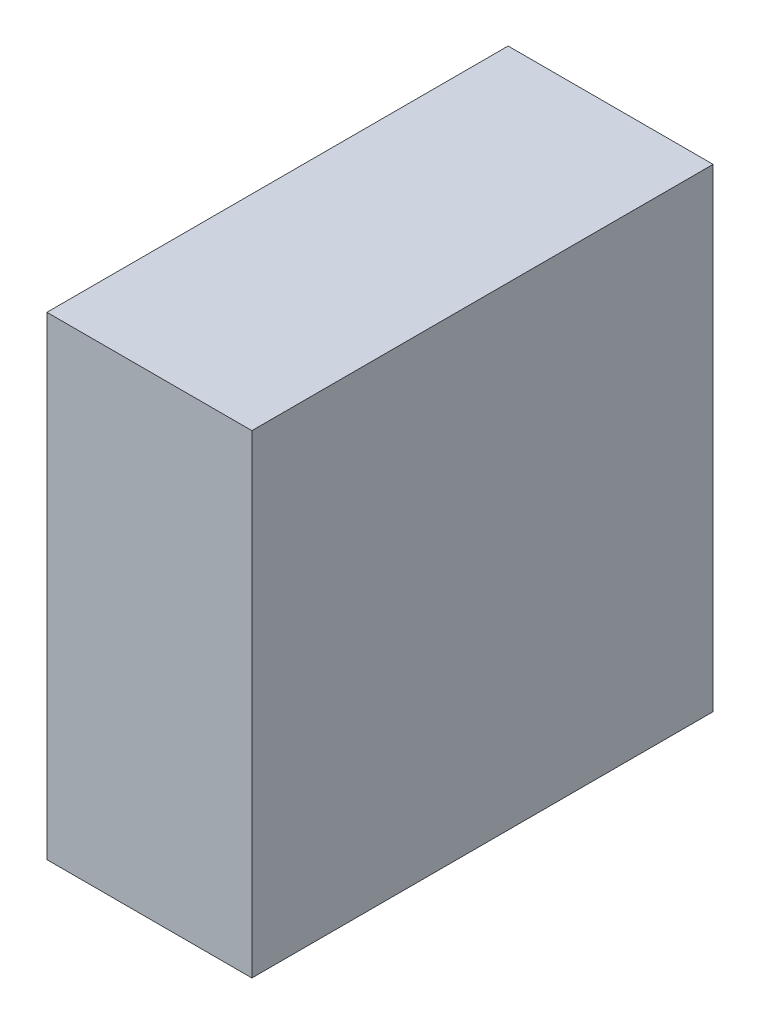
ISO-10303-21;
HEADER;
FILE_DESCRIPTION(('STEP AP214'),'2;1');
FILE_NAME('part.step','',(''),(''),'','','');
FILE_SCHEMA(('AUTOMOTIVE_DESIGN { 1 0 10303 214 1 1 1 1 }'));
ENDSEC;
DATA;
#1=APPLICATION_CONTEXT('core data for automotive mechanical design processes');
#2=APPLICATION_PROTOCOL_DEFINITION('international standard','automotive_design',2000,#1);
#3=PRODUCT_CONTEXT('',#1,'mechanical');
#4=PRODUCT('Part','Part','',(#3));
#5=PRODUCT_RELATED_PRODUCT_CATEGORY('part','',(#4));
#6=PRODUCT_DEFINITION_FORMATION('','',#4);
#7=PRODUCT_DEFINITION_CONTEXT('part definition',#1,'design');
#8=PRODUCT_DEFINITION('design','',#6,#7);
#9=PRODUCT_DEFINITION_SHAPE('','',#8);
#10=(LENGTH_UNIT() NAMED_UNIT(*) SI_UNIT(.MILLI.,.METRE.));
#11=(NAMED_UNIT(*) PLANE_ANGLE_UNIT() SI_UNIT($,.RADIAN.));
#12=(NAMED_UNIT(*) SI_UNIT($,.STERADIAN.) SOLID_ANGLE_UNIT());
#13=UNCERTAINTY_MEASURE_WITH_UNIT(LENGTH_MEASURE(1.E-05),#10,'distance_accuracy_value','');
#14=(GEOMETRIC_REPRESENTATION_CONTEXT(3) GLOBAL_UNCERTAINTY_ASSIGNED_CONTEXT((#13)) GLOBAL_UNIT_ASSIGNED_CONTEXT((#10,
#11,#12)) REPRESENTATION_CONTEXT('',''));
#15=CARTESIAN_POINT('',(0.,0.,0.));
#16=DIRECTION('',(0.,0.,1.));
#17=DIRECTION('',(1.,0.,0.));
#18=AXIS2_PLACEMENT_3D('',#15,#16,#17);
#19=CARTESIAN_POINT('',(4.,-9.24999999999999,-9.));
#20=DIRECTION('',(0.,1.,0.));
#21=DIRECTION('',(0.,0.,1.));
#22=AXIS2_PLACEMENT_3D('',#19,#20,#21);
#23=PLANE('',#22);
#24=DIRECTION('',(0.,0.,-1.));
#25=VECTOR('',#24,1.);
#26=CARTESIAN_POINT('',(-4.,-9.24999999999999,-9.));
#27=LINE('',#26,#25);
#28=CARTESIAN_POINT('',(-4.,-9.24999999999999,9.));
#29=VERTEX_POINT('',#28);
#30=CARTESIAN_POINT('',(-4.,-9.24999999999999,-9.));
#31=VERTEX_POINT('',#30);
#32=EDGE_CURVE('E102',#29,#31,#27,.T.);
#33=ORIENTED_EDGE('',*,*,#32,.T.);
#34=DIRECTION('',(-1.,0.,0.));
#35=VECTOR('',#34,1.);
#36=CARTESIAN_POINT('',(4.,-9.24999999999999,-9.));
#37=LINE('',#36,#35);
#38=CARTESIAN_POINT('',(4.,-9.24999999999999,-9.));
#39=VERTEX_POINT('',#38);
#40=EDGE_CURVE('E11',#39,#31,#37,.T.);
#41=ORIENTED_EDGE('',*,*,#40,.F.);
#42=DIRECTION('',(0.,0.,-1.));
#43=VECTOR('',#42,1.);
#44=CARTESIAN_POINT('',(4.,-9.24999999999999,-9.));
#45=LINE('',#44,#43);
#46=CARTESIAN_POINT('',(4.,-9.24999999999999,9.));
#47=VERTEX_POINT('',#46);
#48=EDGE_CURVE('E87',#47,#39,#45,.T.);
#49=ORIENTED_EDGE('',*,*,#48,.F.);
#50=DIRECTION('',(-1.,0.,0.));
#51=VECTOR('',#50,1.);
#52=CARTESIAN_POINT('',(4.,-9.24999999999999,9.));
#53=LINE('',#52,#51);
#54=EDGE_CURVE('E100',#47,#29,#53,.T.);
#55=ORIENTED_EDGE('',*,*,#54,.T.);
#56=EDGE_LOOP('',(#33,#41,#49,#55));
#57=FACE_BOUND('',#56,.T.);
#58=ADVANCED_FACE('F36',(#57),#23,.F.);
#59=CARTESIAN_POINT('',(4.,9.25000000000001,-9.));
#60=DIRECTION('',(0.,0.,1.));
#61=DIRECTION('',(0.,-1.,0.));
#62=AXIS2_PLACEMENT_3D('',#59,#60,#61);
#63=PLANE('',#62);
#64=DIRECTION('',(0.,1.,0.));
#65=VECTOR('',#64,1.);
#66=CARTESIAN_POINT('',(-4.,9.25000000000001,-9.));
#67=LINE('',#66,#65);
#68=CARTESIAN_POINT('',(-4.,9.25000000000001,-9.));
#69=VERTEX_POINT('',#68);
#70=EDGE_CURVE('E93',#31,#69,#67,.T.);
#71=ORIENTED_EDGE('',*,*,#70,.T.);
#72=DIRECTION('',(-1.,0.,0.));
#73=VECTOR('',#72,1.);
#74=CARTESIAN_POINT('',(4.,9.25000000000001,-9.));
#75=LINE('',#74,#73);
#76=CARTESIAN_POINT('',(4.,9.25000000000001,-9.));
#77=VERTEX_POINT('',#76);
#78=EDGE_CURVE('E46',#77,#69,#75,.T.);
#79=ORIENTED_EDGE('',*,*,#78,.F.);
#80=DIRECTION('',(0.,1.,0.));
#81=VECTOR('',#80,1.);
#82=CARTESIAN_POINT('',(4.,9.25000000000001,-9.));
#83=LINE('',#82,#81);
#84=EDGE_CURVE('E84',#39,#77,#83,.T.);
#85=ORIENTED_EDGE('',*,*,#84,.F.);
#86=ORIENTED_EDGE('',*,*,#40,.T.);
#87=EDGE_LOOP('',(#71,#79,#85,#86));
#88=FACE_BOUND('',#87,.T.);
#89=ADVANCED_FACE('F95',(#88),#63,.F.);
#90=CARTESIAN_POINT('',(4.,9.25000000000001,-9.));
#91=DIRECTION('',(0.,-1.,0.));
#92=DIRECTION('',(0.,0.,-1.));
#93=AXIS2_PLACEMENT_3D('',#90,#91,#92);
#94=PLANE('',#93);
#95=DIRECTION('',(0.,0.,1.));
#96=VECTOR('',#95,1.);
#97=CARTESIAN_POINT('',(-4.,9.25000000000001,-9.));
#98=LINE('',#97,#96);
#99=CARTESIAN_POINT('',(-4.,9.25000000000001,9.));
#100=VERTEX_POINT('',#99);
#101=EDGE_CURVE('E72',#69,#100,#98,.T.);
#102=ORIENTED_EDGE('',*,*,#101,.T.);
#103=DIRECTION('',(-1.,0.,0.));
#104=VECTOR('',#103,1.);
#105=CARTESIAN_POINT('',(4.,9.25000000000001,9.));
#106=LINE('',#105,#104);
#107=CARTESIAN_POINT('',(4.,9.25000000000001,9.));
#108=VERTEX_POINT('',#107);
#109=EDGE_CURVE('E92',#108,#100,#106,.T.);
#110=ORIENTED_EDGE('',*,*,#109,.F.);
#111=DIRECTION('',(0.,0.,1.));
#112=VECTOR('',#111,1.);
#113=CARTESIAN_POINT('',(4.,9.25000000000001,-9.));
#114=LINE('',#113,#112);
#115=EDGE_CURVE('E90',#77,#108,#114,.T.);
#116=ORIENTED_EDGE('',*,*,#115,.F.);
#117=ORIENTED_EDGE('',*,*,#78,.T.);
#118=EDGE_LOOP('',(#102,#110,#116,#117));
#119=FACE_BOUND('',#118,.T.);
#120=ADVANCED_FACE('F94',(#119),#94,.F.);
#121=CARTESIAN_POINT('',(4.,9.25000000000001,9.));
#122=DIRECTION('',(0.,0.,-1.));
#123=DIRECTION('',(-1.,0.,0.));
#124=AXIS2_PLACEMENT_3D('',#121,#122,#123);
#125=PLANE('',#124);
#126=DIRECTION('',(0.,-1.,0.));
#127=VECTOR('',#126,1.);
#128=CARTESIAN_POINT('',(-4.,9.25000000000001,9.));
#129=LINE('',#128,#127);
#130=EDGE_CURVE('E77',#100,#29,#129,.T.);
#131=ORIENTED_EDGE('',*,*,#130,.T.);
#132=ORIENTED_EDGE('',*,*,#54,.F.);
#133=DIRECTION('',(0.,-1.,0.));
#134=VECTOR('',#133,1.);
#135=CARTESIAN_POINT('',(4.,9.25000000000001,9.));
#136=LINE('',#135,#134);
#137=EDGE_CURVE('E53',#108,#47,#136,.T.);
#138=ORIENTED_EDGE('',*,*,#137,.F.);
#139=ORIENTED_EDGE('',*,*,#109,.T.);
#140=EDGE_LOOP('',(#131,#132,#138,#139));
#141=FACE_BOUND('',#140,.T.);
#142=ADVANCED_FACE('F110',(#141),#125,.F.);
#143=CARTESIAN_POINT('',(4.,0.,0.));
#144=DIRECTION('',(1.,0.,0.));
#145=DIRECTION('',(0.,0.,-1.));
#146=AXIS2_PLACEMENT_3D('',#143,#144,#145);
#147=PLANE('',#146);
#148=ORIENTED_EDGE('',*,*,#48,.T.);
#149=ORIENTED_EDGE('',*,*,#84,.T.);
#150=ORIENTED_EDGE('',*,*,#115,.T.);
#151=ORIENTED_EDGE('',*,*,#137,.T.);
#152=EDGE_LOOP('',(#148,#149,#150,#151));
#153=FACE_BOUND('',#152,.T.);
#154=ADVANCED_FACE('F82',(#153),#147,.T.);
#155=CARTESIAN_POINT('',(-4.,0.,0.));
#156=DIRECTION('',(1.,0.,0.));
#157=DIRECTION('',(0.,0.,-1.));
#158=AXIS2_PLACEMENT_3D('',#155,#156,#157);
#159=PLANE('',#158);
#160=ORIENTED_EDGE('',*,*,#32,.F.);
#161=ORIENTED_EDGE('',*,*,#130,.F.);
#162=ORIENTED_EDGE('',*,*,#101,.F.);
#163=ORIENTED_EDGE('',*,*,#70,.F.);
#164=EDGE_LOOP('',(#160,#161,#162,#163));
#165=FACE_BOUND('',#164,.T.);
#166=ADVANCED_FACE('F112',(#165),#159,.F.);
#167=CLOSED_SHELL('',(#58,#89,#120,#142,#154,#166));
#168=MANIFOLD_SOLID_BREP('B2',#167);
#169=ADVANCED_BREP_SHAPE_REPRESENTATION('',(#18,#168),#14);
#170=SHAPE_DEFINITION_REPRESENTATION(#9,#169);
ENDSEC;
END-ISO-10303-21;
